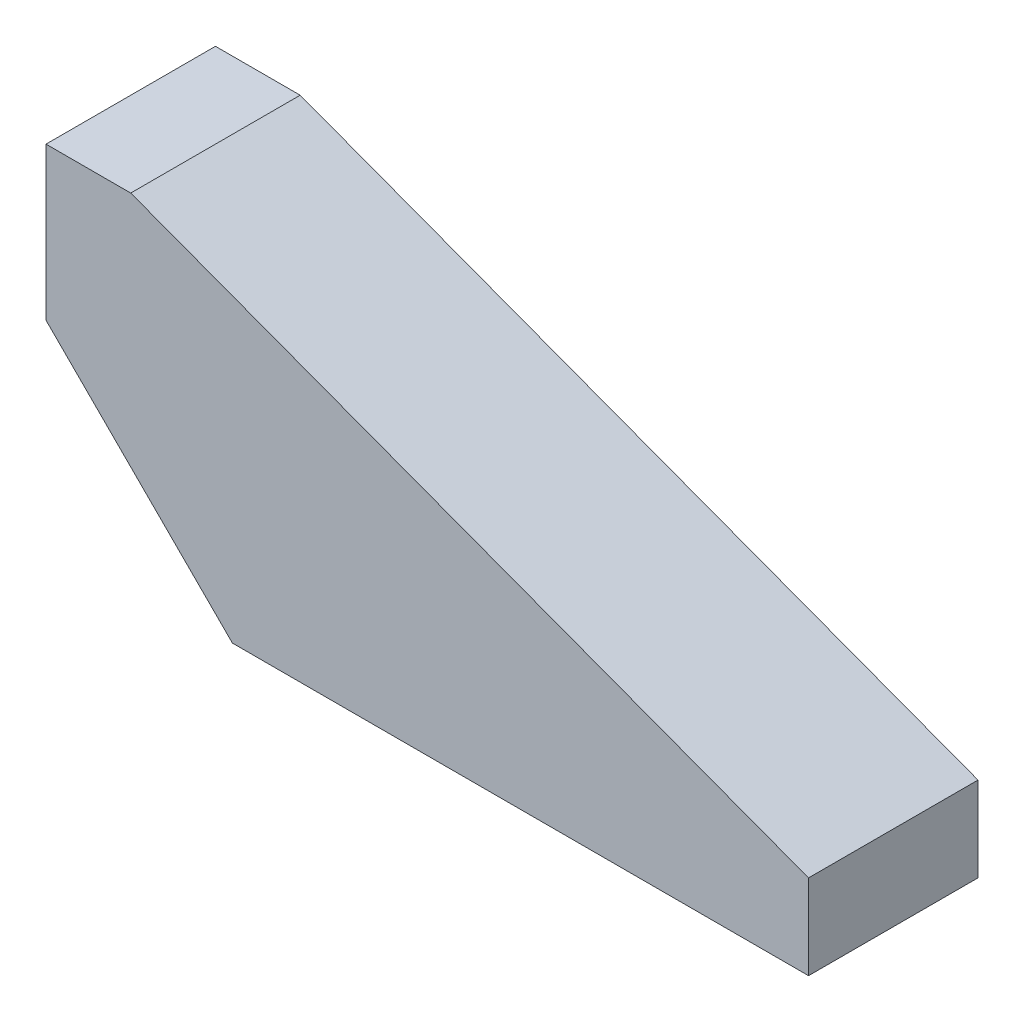
ISO-10303-21;
HEADER;
FILE_DESCRIPTION(('STEP AP214'),'2;1');
FILE_NAME('part.step','',(''),(''),'','','');
FILE_SCHEMA(('AUTOMOTIVE_DESIGN { 1 0 10303 214 1 1 1 1 }'));
ENDSEC;
DATA;
#1=APPLICATION_CONTEXT('core data for automotive mechanical design processes');
#2=APPLICATION_PROTOCOL_DEFINITION('international standard','automotive_design',2000,#1);
#3=PRODUCT_CONTEXT('',#1,'mechanical');
#4=PRODUCT('Part','Part','',(#3));
#5=PRODUCT_RELATED_PRODUCT_CATEGORY('part','',(#4));
#6=PRODUCT_DEFINITION_FORMATION('','',#4);
#7=PRODUCT_DEFINITION_CONTEXT('part definition',#1,'design');
#8=PRODUCT_DEFINITION('design','',#6,#7);
#9=PRODUCT_DEFINITION_SHAPE('','',#8);
#10=(LENGTH_UNIT() NAMED_UNIT(*) SI_UNIT(.MILLI.,.METRE.));
#11=(NAMED_UNIT(*) PLANE_ANGLE_UNIT() SI_UNIT($,.RADIAN.));
#12=(NAMED_UNIT(*) SI_UNIT($,.STERADIAN.) SOLID_ANGLE_UNIT());
#13=UNCERTAINTY_MEASURE_WITH_UNIT(LENGTH_MEASURE(1.E-05),#10,'distance_accuracy_value','');
#14=(GEOMETRIC_REPRESENTATION_CONTEXT(3) GLOBAL_UNCERTAINTY_ASSIGNED_CONTEXT((#13)) GLOBAL_UNIT_ASSIGNED_CONTEXT((#10,
#11,#12)) REPRESENTATION_CONTEXT('',''));
#15=CARTESIAN_POINT('',(0.,0.,0.));
#16=DIRECTION('',(0.,0.,1.));
#17=DIRECTION('',(1.,0.,0.));
#18=AXIS2_PLACEMENT_3D('',#15,#16,#17);
#19=CARTESIAN_POINT('',(0.,-18.,20.));
#20=DIRECTION('',(1.,0.,0.));
#21=DIRECTION('',(0.,0.,-1.));
#22=AXIS2_PLACEMENT_3D('',#19,#20,#21);
#23=PLANE('',#22);
#24=DIRECTION('',(0.,-1.,0.));
#25=VECTOR('',#24,1.);
#26=CARTESIAN_POINT('',(0.,-18.,0.));
#27=LINE('',#26,#25);
#28=CARTESIAN_POINT('',(0.,0.,0.));
#29=VERTEX_POINT('',#28);
#30=CARTESIAN_POINT('',(0.,-18.,0.));
#31=VERTEX_POINT('',#30);
#32=EDGE_CURVE('E119',#29,#31,#27,.T.);
#33=ORIENTED_EDGE('',*,*,#32,.T.);
#34=DIRECTION('',(0.,0.,-1.));
#35=VECTOR('',#34,1.);
#36=CARTESIAN_POINT('',(0.,-18.,20.));
#37=LINE('',#36,#35);
#38=CARTESIAN_POINT('',(0.,-18.,20.));
#39=VERTEX_POINT('',#38);
#40=EDGE_CURVE('E11',#39,#31,#37,.T.);
#41=ORIENTED_EDGE('',*,*,#40,.F.);
#42=DIRECTION('',(0.,-1.,0.));
#43=VECTOR('',#42,1.);
#44=CARTESIAN_POINT('',(0.,-18.,20.));
#45=LINE('',#44,#43);
#46=CARTESIAN_POINT('',(0.,0.,20.));
#47=VERTEX_POINT('',#46);
#48=EDGE_CURVE('E129',#47,#39,#45,.T.);
#49=ORIENTED_EDGE('',*,*,#48,.F.);
#50=DIRECTION('',(0.,0.,-1.));
#51=VECTOR('',#50,1.);
#52=CARTESIAN_POINT('',(0.,0.,20.));
#53=LINE('',#52,#51);
#54=EDGE_CURVE('E115',#47,#29,#53,.T.);
#55=ORIENTED_EDGE('',*,*,#54,.T.);
#56=EDGE_LOOP('',(#33,#41,#49,#55));
#57=FACE_BOUND('',#56,.T.);
#58=ADVANCED_FACE('F35',(#57),#23,.F.);
#59=CARTESIAN_POINT('',(22.,-40.,20.));
#60=DIRECTION('',(0.707106781186548,0.707106781186547,0.));
#61=DIRECTION('',(-0.707106781186547,0.707106781186548,0.));
#62=AXIS2_PLACEMENT_3D('',#59,#60,#61);
#63=PLANE('',#62);
#64=DIRECTION('',(0.707106781186547,-0.707106781186548,0.));
#65=VECTOR('',#64,1.);
#66=CARTESIAN_POINT('',(22.,-40.,0.));
#67=LINE('',#66,#65);
#68=CARTESIAN_POINT('',(22.,-40.,0.));
#69=VERTEX_POINT('',#68);
#70=EDGE_CURVE('E122',#31,#69,#67,.T.);
#71=ORIENTED_EDGE('',*,*,#70,.T.);
#72=DIRECTION('',(0.,0.,-1.));
#73=VECTOR('',#72,1.);
#74=CARTESIAN_POINT('',(22.,-40.,20.));
#75=LINE('',#74,#73);
#76=CARTESIAN_POINT('',(22.,-40.,20.));
#77=VERTEX_POINT('',#76);
#78=EDGE_CURVE('E43',#77,#69,#75,.T.);
#79=ORIENTED_EDGE('',*,*,#78,.F.);
#80=DIRECTION('',(0.707106781186547,-0.707106781186548,0.));
#81=VECTOR('',#80,1.);
#82=CARTESIAN_POINT('',(22.,-40.,20.));
#83=LINE('',#82,#81);
#84=EDGE_CURVE('E88',#39,#77,#83,.T.);
#85=ORIENTED_EDGE('',*,*,#84,.F.);
#86=ORIENTED_EDGE('',*,*,#40,.T.);
#87=EDGE_LOOP('',(#71,#79,#85,#86));
#88=FACE_BOUND('',#87,.T.);
#89=ADVANCED_FACE('F153',(#88),#63,.F.);
#90=CARTESIAN_POINT('',(90.,-40.,20.));
#91=DIRECTION('',(0.,1.,0.));
#92=DIRECTION('',(-1.,0.,0.));
#93=AXIS2_PLACEMENT_3D('',#90,#91,#92);
#94=PLANE('',#93);
#95=DIRECTION('',(1.,0.,0.));
#96=VECTOR('',#95,1.);
#97=CARTESIAN_POINT('',(90.,-40.,0.));
#98=LINE('',#97,#96);
#99=CARTESIAN_POINT('',(90.,-40.,0.));
#100=VERTEX_POINT('',#99);
#101=EDGE_CURVE('E124',#69,#100,#98,.T.);
#102=ORIENTED_EDGE('',*,*,#101,.T.);
#103=DIRECTION('',(0.,0.,-1.));
#104=VECTOR('',#103,1.);
#105=CARTESIAN_POINT('',(90.,-40.,20.));
#106=LINE('',#105,#104);
#107=CARTESIAN_POINT('',(90.,-40.,20.));
#108=VERTEX_POINT('',#107);
#109=EDGE_CURVE('E110',#108,#100,#106,.T.);
#110=ORIENTED_EDGE('',*,*,#109,.F.);
#111=DIRECTION('',(1.,0.,0.));
#112=VECTOR('',#111,1.);
#113=CARTESIAN_POINT('',(90.,-40.,20.));
#114=LINE('',#113,#112);
#115=EDGE_CURVE('E101',#77,#108,#114,.T.);
#116=ORIENTED_EDGE('',*,*,#115,.F.);
#117=ORIENTED_EDGE('',*,*,#78,.T.);
#118=EDGE_LOOP('',(#102,#110,#116,#117));
#119=FACE_BOUND('',#118,.T.);
#120=ADVANCED_FACE('F135',(#119),#94,.F.);
#121=CARTESIAN_POINT('',(90.,-30.,20.));
#122=DIRECTION('',(-1.,0.,0.));
#123=DIRECTION('',(0.,0.,1.));
#124=AXIS2_PLACEMENT_3D('',#121,#122,#123);
#125=PLANE('',#124);
#126=DIRECTION('',(0.,1.,0.));
#127=VECTOR('',#126,1.);
#128=CARTESIAN_POINT('',(90.,-30.,0.));
#129=LINE('',#128,#127);
#130=CARTESIAN_POINT('',(90.,-30.,0.));
#131=VERTEX_POINT('',#130);
#132=EDGE_CURVE('E109',#100,#131,#129,.T.);
#133=ORIENTED_EDGE('',*,*,#132,.T.);
#134=DIRECTION('',(0.,0.,-1.));
#135=VECTOR('',#134,1.);
#136=CARTESIAN_POINT('',(90.,-30.,20.));
#137=LINE('',#136,#135);
#138=CARTESIAN_POINT('',(90.,-30.,20.));
#139=VERTEX_POINT('',#138);
#140=EDGE_CURVE('E106',#139,#131,#137,.T.);
#141=ORIENTED_EDGE('',*,*,#140,.F.);
#142=DIRECTION('',(0.,1.,0.));
#143=VECTOR('',#142,1.);
#144=CARTESIAN_POINT('',(90.,-30.,20.));
#145=LINE('',#144,#143);
#146=EDGE_CURVE('E95',#108,#139,#145,.T.);
#147=ORIENTED_EDGE('',*,*,#146,.F.);
#148=ORIENTED_EDGE('',*,*,#109,.T.);
#149=EDGE_LOOP('',(#133,#141,#147,#148));
#150=FACE_BOUND('',#149,.T.);
#151=ADVANCED_FACE('F107',(#150),#125,.F.);
#152=CARTESIAN_POINT('',(10.,0.,20.));
#153=DIRECTION('',(-0.351123441588392,-0.936329177569045,0.));
#154=DIRECTION('',(0.936329177569045,-0.351123441588392,0.));
#155=AXIS2_PLACEMENT_3D('',#152,#153,#154);
#156=PLANE('',#155);
#157=DIRECTION('',(-0.936329177569045,0.351123441588392,0.));
#158=VECTOR('',#157,1.);
#159=CARTESIAN_POINT('',(10.,0.,0.));
#160=LINE('',#159,#158);
#161=CARTESIAN_POINT('',(10.,0.,0.));
#162=VERTEX_POINT('',#161);
#163=EDGE_CURVE('E74',#131,#162,#160,.T.);
#164=ORIENTED_EDGE('',*,*,#163,.T.);
#165=DIRECTION('',(0.,0.,-1.));
#166=VECTOR('',#165,1.);
#167=CARTESIAN_POINT('',(10.,0.,20.));
#168=LINE('',#167,#166);
#169=CARTESIAN_POINT('',(10.,0.,20.));
#170=VERTEX_POINT('',#169);
#171=EDGE_CURVE('E111',#170,#162,#168,.T.);
#172=ORIENTED_EDGE('',*,*,#171,.F.);
#173=DIRECTION('',(-0.936329177569045,0.351123441588392,0.));
#174=VECTOR('',#173,1.);
#175=CARTESIAN_POINT('',(10.,0.,20.));
#176=LINE('',#175,#174);
#177=EDGE_CURVE('E99',#139,#170,#176,.T.);
#178=ORIENTED_EDGE('',*,*,#177,.F.);
#179=ORIENTED_EDGE('',*,*,#140,.T.);
#180=EDGE_LOOP('',(#164,#172,#178,#179));
#181=FACE_BOUND('',#180,.T.);
#182=ADVANCED_FACE('F113',(#181),#156,.F.);
#183=CARTESIAN_POINT('',(0.,0.,20.));
#184=DIRECTION('',(0.,-1.,0.));
#185=DIRECTION('',(0.,0.,-1.));
#186=AXIS2_PLACEMENT_3D('',#183,#184,#185);
#187=PLANE('',#186);
#188=DIRECTION('',(-1.,0.,0.));
#189=VECTOR('',#188,1.);
#190=CARTESIAN_POINT('',(0.,0.,0.));
#191=LINE('',#190,#189);
#192=EDGE_CURVE('E80',#162,#29,#191,.T.);
#193=ORIENTED_EDGE('',*,*,#192,.T.);
#194=ORIENTED_EDGE('',*,*,#54,.F.);
#195=DIRECTION('',(-1.,0.,0.));
#196=VECTOR('',#195,1.);
#197=CARTESIAN_POINT('',(0.,0.,20.));
#198=LINE('',#197,#196);
#199=EDGE_CURVE('E51',#170,#47,#198,.T.);
#200=ORIENTED_EDGE('',*,*,#199,.F.);
#201=ORIENTED_EDGE('',*,*,#171,.T.);
#202=EDGE_LOOP('',(#193,#194,#200,#201));
#203=FACE_BOUND('',#202,.T.);
#204=ADVANCED_FACE('F142',(#203),#187,.F.);
#205=CARTESIAN_POINT('',(0.,0.,20.));
#206=DIRECTION('',(0.,0.,-1.));
#207=DIRECTION('',(-1.,0.,0.));
#208=AXIS2_PLACEMENT_3D('',#205,#206,#207);
#209=PLANE('',#208);
#210=ORIENTED_EDGE('',*,*,#48,.T.);
#211=ORIENTED_EDGE('',*,*,#84,.T.);
#212=ORIENTED_EDGE('',*,*,#115,.T.);
#213=ORIENTED_EDGE('',*,*,#146,.T.);
#214=ORIENTED_EDGE('',*,*,#177,.T.);
#215=ORIENTED_EDGE('',*,*,#199,.T.);
#216=EDGE_LOOP('',(#210,#211,#212,#213,#214,#215));
#217=FACE_BOUND('',#216,.T.);
#218=ADVANCED_FACE('F97',(#217),#209,.F.);
#219=CARTESIAN_POINT('',(0.,0.,0.));
#220=DIRECTION('',(0.,0.,-1.));
#221=DIRECTION('',(-1.,0.,0.));
#222=AXIS2_PLACEMENT_3D('',#219,#220,#221);
#223=PLANE('',#222);
#224=ORIENTED_EDGE('',*,*,#32,.F.);
#225=ORIENTED_EDGE('',*,*,#192,.F.);
#226=ORIENTED_EDGE('',*,*,#163,.F.);
#227=ORIENTED_EDGE('',*,*,#132,.F.);
#228=ORIENTED_EDGE('',*,*,#101,.F.);
#229=ORIENTED_EDGE('',*,*,#70,.F.);
#230=EDGE_LOOP('',(#224,#225,#226,#227,#228,#229));
#231=FACE_BOUND('',#230,.T.);
#232=ADVANCED_FACE('F138',(#231),#223,.T.);
#233=CLOSED_SHELL('',(#58,#89,#120,#151,#182,#204,#218,#232));
#234=MANIFOLD_SOLID_BREP('B2',#233);
#235=ADVANCED_BREP_SHAPE_REPRESENTATION('',(#18,#234),#14);
#236=SHAPE_DEFINITION_REPRESENTATION(#9,#235);
ENDSEC;
END-ISO-10303-21;
